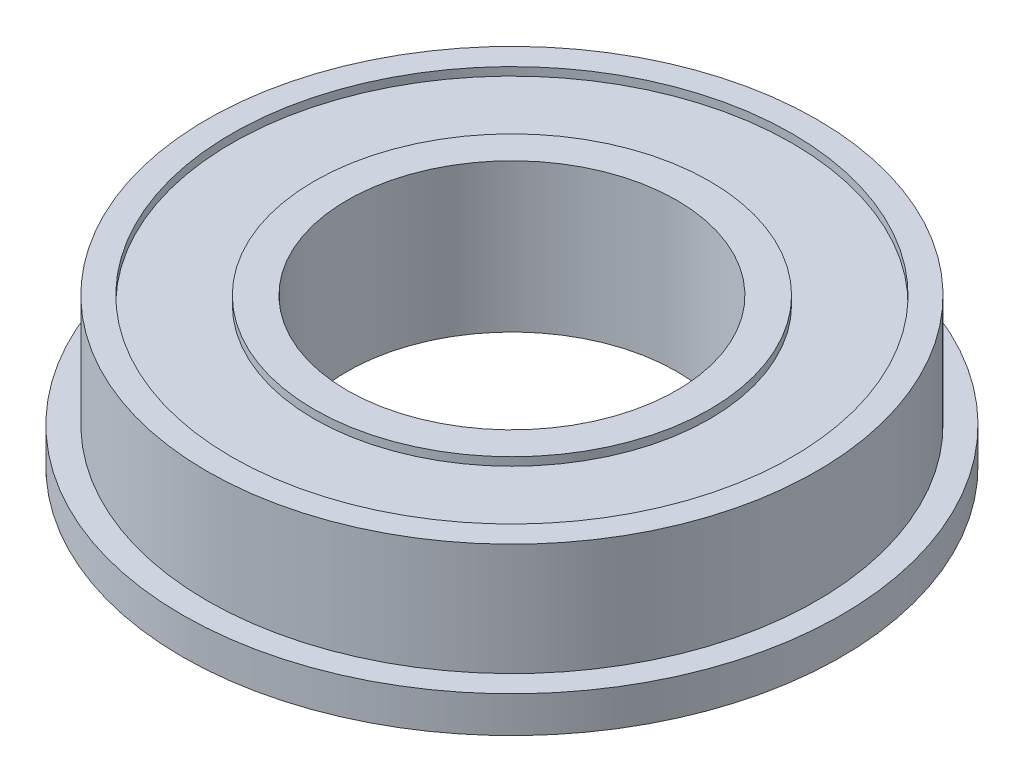
ISO-10303-21;
HEADER;
FILE_DESCRIPTION(('STEP AP214'),'2;1');
FILE_NAME('part.step','',(''),(''),'','','');
FILE_SCHEMA(('AUTOMOTIVE_DESIGN { 1 0 10303 214 1 1 1 1 }'));
ENDSEC;
DATA;
#1=APPLICATION_CONTEXT('core data for automotive mechanical design processes');
#2=APPLICATION_PROTOCOL_DEFINITION('international standard','automotive_design',2000,#1);
#3=PRODUCT_CONTEXT('',#1,'mechanical');
#4=PRODUCT('Part','Part','',(#3));
#5=PRODUCT_RELATED_PRODUCT_CATEGORY('part','',(#4));
#6=PRODUCT_DEFINITION_FORMATION('','',#4);
#7=PRODUCT_DEFINITION_CONTEXT('part definition',#1,'design');
#8=PRODUCT_DEFINITION('design','',#6,#7);
#9=PRODUCT_DEFINITION_SHAPE('','',#8);
#10=(LENGTH_UNIT() NAMED_UNIT(*) SI_UNIT(.MILLI.,.METRE.));
#11=(NAMED_UNIT(*) PLANE_ANGLE_UNIT() SI_UNIT($,.RADIAN.));
#12=(NAMED_UNIT(*) SI_UNIT($,.STERADIAN.) SOLID_ANGLE_UNIT());
#13=UNCERTAINTY_MEASURE_WITH_UNIT(LENGTH_MEASURE(1.E-05),#10,'distance_accuracy_value','');
#14=(GEOMETRIC_REPRESENTATION_CONTEXT(3) GLOBAL_UNCERTAINTY_ASSIGNED_CONTEXT((#13)) GLOBAL_UNIT_ASSIGNED_CONTEXT((#10,
#11,#12)) REPRESENTATION_CONTEXT('',''));
#15=CARTESIAN_POINT('',(0.,0.,0.));
#16=DIRECTION('',(0.,0.,1.));
#17=DIRECTION('',(1.,0.,0.));
#18=AXIS2_PLACEMENT_3D('',#15,#16,#17);
#19=CARTESIAN_POINT('',(0.,9.,0.));
#20=DIRECTION('',(0.,1.,0.));
#21=DIRECTION('',(0.,0.,1.));
#22=AXIS2_PLACEMENT_3D('',#19,#20,#21);
#23=PLANE('',#22);
#24=CARTESIAN_POINT('',(0.,9.,0.));
#25=DIRECTION('',(0.,1.,0.));
#26=DIRECTION('',(0.,0.,1.));
#27=AXIS2_PLACEMENT_3D('',#24,#25,#26);
#28=CIRCLE('',#27,10.);
#29=CARTESIAN_POINT('',(0.,9.,10.));
#30=VERTEX_POINT('',#29);
#31=EDGE_CURVE('E62',#30,#30,#28,.T.);
#32=ORIENTED_EDGE('',*,*,#31,.F.);
#33=EDGE_LOOP('',(#32));
#34=FACE_BOUND('',#33,.T.);
#35=CARTESIAN_POINT('',(0.,9.,0.));
#36=DIRECTION('',(0.,1.,0.));
#37=DIRECTION('',(0.,0.,1.));
#38=AXIS2_PLACEMENT_3D('',#35,#36,#37);
#39=CIRCLE('',#38,12.);
#40=CARTESIAN_POINT('',(0.,9.,12.));
#41=VERTEX_POINT('',#40);
#42=EDGE_CURVE('E94',#41,#41,#39,.T.);
#43=ORIENTED_EDGE('',*,*,#42,.T.);
#44=EDGE_LOOP('',(#43));
#45=FACE_BOUND('',#44,.T.);
#46=ADVANCED_FACE('F41',(#34,#45),#23,.T.);
#47=CARTESIAN_POINT('',(0.,0.,0.));
#48=DIRECTION('',(0.,1.,0.));
#49=DIRECTION('',(0.,0.,1.));
#50=AXIS2_PLACEMENT_3D('',#47,#48,#49);
#51=PLANE('',#50);
#52=CARTESIAN_POINT('',(0.,0.,0.));
#53=DIRECTION('',(0.,1.,0.));
#54=DIRECTION('',(0.,0.,1.));
#55=AXIS2_PLACEMENT_3D('',#52,#53,#54);
#56=CIRCLE('',#55,10.);
#57=CARTESIAN_POINT('',(0.,0.,10.));
#58=VERTEX_POINT('',#57);
#59=EDGE_CURVE('E61',#58,#58,#56,.T.);
#60=ORIENTED_EDGE('',*,*,#59,.T.);
#61=EDGE_LOOP('',(#60));
#62=FACE_BOUND('',#61,.T.);
#63=CARTESIAN_POINT('',(0.,0.,0.));
#64=DIRECTION('',(0.,-1.,0.));
#65=DIRECTION('',(0.,0.,-1.));
#66=AXIS2_PLACEMENT_3D('',#63,#64,#65);
#67=CIRCLE('',#66,12.);
#68=CARTESIAN_POINT('',(0.,0.,-12.));
#69=VERTEX_POINT('',#68);
#70=EDGE_CURVE('E78',#69,#69,#67,.T.);
#71=ORIENTED_EDGE('',*,*,#70,.T.);
#72=EDGE_LOOP('',(#71));
#73=FACE_BOUND('',#72,.T.);
#74=ADVANCED_FACE('F134',(#62,#73),#51,.F.);
#75=CARTESIAN_POINT('',(0.,2.2,0.));
#76=DIRECTION('',(0.,-1.,0.));
#77=DIRECTION('',(0.,0.,-1.));
#78=AXIS2_PLACEMENT_3D('',#75,#76,#77);
#79=CYLINDRICAL_SURFACE('',#78,20.);
#80=CARTESIAN_POINT('',(0.,2.2,0.));
#81=DIRECTION('',(0.,1.,0.));
#82=DIRECTION('',(0.,0.,1.));
#83=AXIS2_PLACEMENT_3D('',#80,#81,#82);
#84=CIRCLE('',#83,20.);
#85=CARTESIAN_POINT('',(0.,2.2,20.));
#86=VERTEX_POINT('',#85);
#87=EDGE_CURVE('E50',#86,#86,#84,.T.);
#88=ORIENTED_EDGE('',*,*,#87,.F.);
#89=EDGE_LOOP('',(#88));
#90=FACE_BOUND('',#89,.T.);
#91=CARTESIAN_POINT('',(0.,0.,0.));
#92=DIRECTION('',(0.,1.,0.));
#93=DIRECTION('',(0.,0.,1.));
#94=AXIS2_PLACEMENT_3D('',#91,#92,#93);
#95=CIRCLE('',#94,20.);
#96=CARTESIAN_POINT('',(0.,0.,20.));
#97=VERTEX_POINT('',#96);
#98=EDGE_CURVE('E45',#97,#97,#95,.T.);
#99=ORIENTED_EDGE('',*,*,#98,.T.);
#100=EDGE_LOOP('',(#99));
#101=FACE_BOUND('',#100,.T.);
#102=ADVANCED_FACE('F43',(#90,#101),#79,.T.);
#103=CARTESIAN_POINT('',(0.,2.2,0.));
#104=DIRECTION('',(0.,1.,0.));
#105=DIRECTION('',(0.,0.,1.));
#106=AXIS2_PLACEMENT_3D('',#103,#104,#105);
#107=PLANE('',#106);
#108=CARTESIAN_POINT('',(0.,2.2,0.));
#109=DIRECTION('',(0.,1.,0.));
#110=DIRECTION('',(0.,0.,1.));
#111=AXIS2_PLACEMENT_3D('',#108,#109,#110);
#112=CIRCLE('',#111,18.5);
#113=CARTESIAN_POINT('',(0.,2.2,18.5));
#114=VERTEX_POINT('',#113);
#115=EDGE_CURVE('E10',#114,#114,#112,.T.);
#116=ORIENTED_EDGE('',*,*,#115,.F.);
#117=EDGE_LOOP('',(#116));
#118=FACE_BOUND('',#117,.T.);
#119=ORIENTED_EDGE('',*,*,#87,.T.);
#120=EDGE_LOOP('',(#119));
#121=FACE_BOUND('',#120,.T.);
#122=ADVANCED_FACE('F132',(#118,#121),#107,.T.);
#123=CARTESIAN_POINT('',(0.,0.,0.));
#124=DIRECTION('',(0.,-1.,0.));
#125=DIRECTION('',(0.,0.,-1.));
#126=AXIS2_PLACEMENT_3D('',#123,#124,#125);
#127=CIRCLE('',#126,17.);
#128=CARTESIAN_POINT('',(0.,0.,-17.));
#129=VERTEX_POINT('',#128);
#130=EDGE_CURVE('E70',#129,#129,#127,.T.);
#131=ORIENTED_EDGE('',*,*,#130,.F.);
#132=EDGE_LOOP('',(#131));
#133=FACE_BOUND('',#132,.T.);
#134=ORIENTED_EDGE('',*,*,#98,.F.);
#135=EDGE_LOOP('',(#134));
#136=FACE_BOUND('',#135,.T.);
#137=ADVANCED_FACE('F127',(#133,#136),#51,.F.);
#138=CARTESIAN_POINT('',(0.,9.,0.));
#139=DIRECTION('',(0.,-1.,0.));
#140=DIRECTION('',(0.,0.,-1.));
#141=AXIS2_PLACEMENT_3D('',#138,#139,#140);
#142=CYLINDRICAL_SURFACE('',#141,18.5);
#143=CARTESIAN_POINT('',(0.,9.,0.));
#144=DIRECTION('',(0.,1.,0.));
#145=DIRECTION('',(0.,0.,1.));
#146=AXIS2_PLACEMENT_3D('',#143,#144,#145);
#147=CIRCLE('',#146,18.5);
#148=CARTESIAN_POINT('',(0.,9.,18.5));
#149=VERTEX_POINT('',#148);
#150=EDGE_CURVE('E57',#149,#149,#147,.T.);
#151=ORIENTED_EDGE('',*,*,#150,.F.);
#152=EDGE_LOOP('',(#151));
#153=FACE_BOUND('',#152,.T.);
#154=ORIENTED_EDGE('',*,*,#115,.T.);
#155=EDGE_LOOP('',(#154));
#156=FACE_BOUND('',#155,.T.);
#157=ADVANCED_FACE('F122',(#153,#156),#142,.T.);
#158=CARTESIAN_POINT('',(0.,9.,0.));
#159=DIRECTION('',(0.,1.,0.));
#160=DIRECTION('',(0.,0.,1.));
#161=AXIS2_PLACEMENT_3D('',#158,#159,#160);
#162=CIRCLE('',#161,17.);
#163=CARTESIAN_POINT('',(0.,9.,17.));
#164=VERTEX_POINT('',#163);
#165=EDGE_CURVE('E86',#164,#164,#162,.T.);
#166=ORIENTED_EDGE('',*,*,#165,.F.);
#167=EDGE_LOOP('',(#166));
#168=FACE_BOUND('',#167,.T.);
#169=ORIENTED_EDGE('',*,*,#150,.T.);
#170=EDGE_LOOP('',(#169));
#171=FACE_BOUND('',#170,.T.);
#172=ADVANCED_FACE('F118',(#168,#171),#23,.T.);
#173=CARTESIAN_POINT('',(0.,0.,0.));
#174=DIRECTION('',(0.,1.,0.));
#175=DIRECTION('',(0.,0.,1.));
#176=AXIS2_PLACEMENT_3D('',#173,#174,#175);
#177=CYLINDRICAL_SURFACE('',#176,10.);
#178=ORIENTED_EDGE('',*,*,#59,.F.);
#179=EDGE_LOOP('',(#178));
#180=FACE_BOUND('',#179,.T.);
#181=ORIENTED_EDGE('',*,*,#31,.T.);
#182=EDGE_LOOP('',(#181));
#183=FACE_BOUND('',#182,.T.);
#184=ADVANCED_FACE('F121',(#180,#183),#177,.F.);
#185=CARTESIAN_POINT('',(0.,0.5,0.));
#186=DIRECTION('',(0.,-1.,0.));
#187=DIRECTION('',(0.,0.,-1.));
#188=AXIS2_PLACEMENT_3D('',#185,#186,#187);
#189=CYLINDRICAL_SURFACE('',#188,17.);
#190=CARTESIAN_POINT('',(0.,0.5,0.));
#191=DIRECTION('',(0.,-1.,0.));
#192=DIRECTION('',(0.,0.,-1.));
#193=AXIS2_PLACEMENT_3D('',#190,#191,#192);
#194=CIRCLE('',#193,17.);
#195=CARTESIAN_POINT('',(0.,0.5,-17.));
#196=VERTEX_POINT('',#195);
#197=EDGE_CURVE('E66',#196,#196,#194,.T.);
#198=ORIENTED_EDGE('',*,*,#197,.F.);
#199=EDGE_LOOP('',(#198));
#200=FACE_BOUND('',#199,.T.);
#201=ORIENTED_EDGE('',*,*,#130,.T.);
#202=EDGE_LOOP('',(#201));
#203=FACE_BOUND('',#202,.T.);
#204=ADVANCED_FACE('F147',(#200,#203),#189,.F.);
#205=CARTESIAN_POINT('',(0.,0.5,0.));
#206=DIRECTION('',(0.,-1.,0.));
#207=DIRECTION('',(0.,0.,-1.));
#208=AXIS2_PLACEMENT_3D('',#205,#206,#207);
#209=PLANE('',#208);
#210=CARTESIAN_POINT('',(0.,0.5,0.));
#211=DIRECTION('',(0.,-1.,0.));
#212=DIRECTION('',(0.,0.,-1.));
#213=AXIS2_PLACEMENT_3D('',#210,#211,#212);
#214=CIRCLE('',#213,12.);
#215=CARTESIAN_POINT('',(0.,0.5,-12.));
#216=VERTEX_POINT('',#215);
#217=EDGE_CURVE('E74',#216,#216,#214,.T.);
#218=ORIENTED_EDGE('',*,*,#217,.F.);
#219=EDGE_LOOP('',(#218));
#220=FACE_BOUND('',#219,.T.);
#221=ORIENTED_EDGE('',*,*,#197,.T.);
#222=EDGE_LOOP('',(#221));
#223=FACE_BOUND('',#222,.T.);
#224=ADVANCED_FACE('F151',(#220,#223),#209,.T.);
#225=CARTESIAN_POINT('',(0.,0.5,0.));
#226=DIRECTION('',(0.,-1.,0.));
#227=DIRECTION('',(0.,0.,-1.));
#228=AXIS2_PLACEMENT_3D('',#225,#226,#227);
#229=CYLINDRICAL_SURFACE('',#228,12.);
#230=ORIENTED_EDGE('',*,*,#217,.T.);
#231=EDGE_LOOP('',(#230));
#232=FACE_BOUND('',#231,.T.);
#233=ORIENTED_EDGE('',*,*,#70,.F.);
#234=EDGE_LOOP('',(#233));
#235=FACE_BOUND('',#234,.T.);
#236=ADVANCED_FACE('F114',(#232,#235),#229,.T.);
#237=CARTESIAN_POINT('',(0.,8.5,0.));
#238=DIRECTION('',(0.,1.,0.));
#239=DIRECTION('',(0.,0.,1.));
#240=AXIS2_PLACEMENT_3D('',#237,#238,#239);
#241=CYLINDRICAL_SURFACE('',#240,17.);
#242=CARTESIAN_POINT('',(0.,8.5,0.));
#243=DIRECTION('',(0.,1.,0.));
#244=DIRECTION('',(0.,0.,1.));
#245=AXIS2_PLACEMENT_3D('',#242,#243,#244);
#246=CIRCLE('',#245,17.);
#247=CARTESIAN_POINT('',(0.,8.5,17.));
#248=VERTEX_POINT('',#247);
#249=EDGE_CURVE('E82',#248,#248,#246,.T.);
#250=ORIENTED_EDGE('',*,*,#249,.F.);
#251=EDGE_LOOP('',(#250));
#252=FACE_BOUND('',#251,.T.);
#253=ORIENTED_EDGE('',*,*,#165,.T.);
#254=EDGE_LOOP('',(#253));
#255=FACE_BOUND('',#254,.T.);
#256=ADVANCED_FACE('F108',(#252,#255),#241,.F.);
#257=CARTESIAN_POINT('',(0.,8.5,0.));
#258=DIRECTION('',(0.,1.,0.));
#259=DIRECTION('',(0.,0.,1.));
#260=AXIS2_PLACEMENT_3D('',#257,#258,#259);
#261=PLANE('',#260);
#262=CARTESIAN_POINT('',(0.,8.5,0.));
#263=DIRECTION('',(0.,1.,0.));
#264=DIRECTION('',(0.,0.,1.));
#265=AXIS2_PLACEMENT_3D('',#262,#263,#264);
#266=CIRCLE('',#265,12.);
#267=CARTESIAN_POINT('',(0.,8.5,12.));
#268=VERTEX_POINT('',#267);
#269=EDGE_CURVE('E90',#268,#268,#266,.T.);
#270=ORIENTED_EDGE('',*,*,#269,.F.);
#271=EDGE_LOOP('',(#270));
#272=FACE_BOUND('',#271,.T.);
#273=ORIENTED_EDGE('',*,*,#249,.T.);
#274=EDGE_LOOP('',(#273));
#275=FACE_BOUND('',#274,.T.);
#276=ADVANCED_FACE('F105',(#272,#275),#261,.T.);
#277=CARTESIAN_POINT('',(0.,8.5,0.));
#278=DIRECTION('',(0.,1.,0.));
#279=DIRECTION('',(0.,0.,1.));
#280=AXIS2_PLACEMENT_3D('',#277,#278,#279);
#281=CYLINDRICAL_SURFACE('',#280,12.);
#282=ORIENTED_EDGE('',*,*,#269,.T.);
#283=EDGE_LOOP('',(#282));
#284=FACE_BOUND('',#283,.T.);
#285=ORIENTED_EDGE('',*,*,#42,.F.);
#286=EDGE_LOOP('',(#285));
#287=FACE_BOUND('',#286,.T.);
#288=ADVANCED_FACE('F102',(#284,#287),#281,.T.);
#289=CLOSED_SHELL('',(#46,#74,#102,#122,#137,#157,#172,#184,#204,#224,#236,#256,#276,#288));
#290=MANIFOLD_SOLID_BREP('B2',#289);
#291=ADVANCED_BREP_SHAPE_REPRESENTATION('',(#18,#290),#14);
#292=SHAPE_DEFINITION_REPRESENTATION(#9,#291);
ENDSEC;
END-ISO-10303-21;
